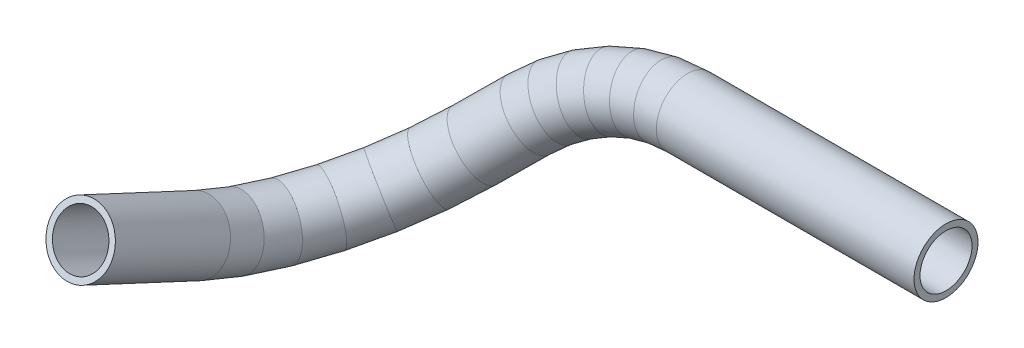
ISO-10303-21;
HEADER;
FILE_DESCRIPTION(('STEP AP214'),'2;1');
FILE_NAME('part.step','',(''),(''),'','','');
FILE_SCHEMA(('AUTOMOTIVE_DESIGN { 1 0 10303 214 1 1 1 1 }'));
ENDSEC;
DATA;
#1=APPLICATION_CONTEXT('core data for automotive mechanical design processes');
#2=APPLICATION_PROTOCOL_DEFINITION('international standard','automotive_design',2000,#1);
#3=PRODUCT_CONTEXT('',#1,'mechanical');
#4=PRODUCT('Part','Part','',(#3));
#5=PRODUCT_RELATED_PRODUCT_CATEGORY('part','',(#4));
#6=PRODUCT_DEFINITION_FORMATION('','',#4);
#7=PRODUCT_DEFINITION_CONTEXT('part definition',#1,'design');
#8=PRODUCT_DEFINITION('design','',#6,#7);
#9=PRODUCT_DEFINITION_SHAPE('','',#8);
#10=(LENGTH_UNIT() NAMED_UNIT(*) SI_UNIT(.MILLI.,.METRE.));
#11=(NAMED_UNIT(*) PLANE_ANGLE_UNIT() SI_UNIT($,.RADIAN.));
#12=(NAMED_UNIT(*) SI_UNIT($,.STERADIAN.) SOLID_ANGLE_UNIT());
#13=UNCERTAINTY_MEASURE_WITH_UNIT(LENGTH_MEASURE(1.E-05),#10,'distance_accuracy_value','');
#14=(GEOMETRIC_REPRESENTATION_CONTEXT(3) GLOBAL_UNCERTAINTY_ASSIGNED_CONTEXT((#13)) GLOBAL_UNIT_ASSIGNED_CONTEXT((#10,
#11,#12)) REPRESENTATION_CONTEXT('',''));
#15=CARTESIAN_POINT('',(0.,0.,0.));
#16=DIRECTION('',(0.,0.,1.));
#17=DIRECTION('',(1.,0.,0.));
#18=AXIS2_PLACEMENT_3D('',#15,#16,#17);
#19=CARTESIAN_POINT('',(-40.,41.0497842766596,-31.1369569621188));
#20=DIRECTION('',(0.,0.422618261740699,0.90630778703665));
#21=DIRECTION('',(0.,-0.90630778703665,0.422618261740699));
#22=AXIS2_PLACEMENT_3D('',#19,#20,#21);
#23=CYLINDRICAL_SURFACE('',#22,3.8735);
#24=CARTESIAN_POINT('',(-40.,41.0497842766596,-31.1369569621188));
#25=DIRECTION('',(-0.0379906105368384,0.380773401827311,0.923887617609358));
#26=DIRECTION('',(-0.641009785049474,-0.718554589404212,0.269788356896609));
#27=AXIS2_PLACEMENT_3D('',#24,#25,#26);
#28=ELLIPSE('',#27,3.88029697891968,3.8735);
#29=CARTESIAN_POINT('',(-42.4873083323854,38.2615790742056,-30.0900980159052));
#30=VERTEX_POINT('',#29);
#31=EDGE_CURVE('E68',#30,#30,#28,.T.);
#32=ORIENTED_EDGE('',*,*,#31,.F.);
#33=EDGE_LOOP('',(#32));
#34=FACE_BOUND('',#33,.T.);
#35=CARTESIAN_POINT('',(-40.,49.1453881812796,-13.7758783629571));
#36=DIRECTION('',(0.,0.422618261740699,0.90630778703665));
#37=DIRECTION('',(0.,-0.90630778703665,0.422618261740699));
#38=AXIS2_PLACEMENT_3D('',#35,#36,#37);
#39=CIRCLE('',#38,3.8735);
#40=CARTESIAN_POINT('',(-40.,45.6348049681931,-12.1388665261045));
#41=VERTEX_POINT('',#40);
#42=EDGE_CURVE('E11',#41,#41,#39,.F.);
#43=ORIENTED_EDGE('',*,*,#42,.F.);
#44=EDGE_LOOP('',(#43));
#45=FACE_BOUND('',#44,.T.);
#46=ADVANCED_FACE('F52',(#34,#45),#23,.F.);
#47=CARTESIAN_POINT('',(-40.,41.0497842766596,-31.1369569621188));
#48=DIRECTION('',(0.,0.422618261740699,0.90630778703665));
#49=DIRECTION('',(0.,-0.90630778703665,0.422618261740699));
#50=AXIS2_PLACEMENT_3D('',#47,#48,#49);
#51=CYLINDRICAL_SURFACE('',#50,4.7625);
#52=CARTESIAN_POINT('',(-40.,41.0497842766596,-31.1369569621188));
#53=DIRECTION('',(-0.0379906105368384,0.380773401827311,0.923887617609358));
#54=DIRECTION('',(-0.641009785049474,-0.718554589404212,0.269788356896609));
#55=AXIS2_PLACEMENT_3D('',#52,#53,#54);
#56=ELLIPSE('',#55,4.77085694129469,4.7625);
#57=CARTESIAN_POINT('',(-43.0581659824411,37.6216631261014,-29.8498353069381));
#58=VERTEX_POINT('',#57);
#59=EDGE_CURVE('E63',#58,#58,#56,.T.);
#60=ORIENTED_EDGE('',*,*,#59,.T.);
#61=EDGE_LOOP('',(#60));
#62=FACE_BOUND('',#61,.T.);
#63=CARTESIAN_POINT('',(-40.,49.1453881812796,-13.7758783629571));
#64=DIRECTION('',(0.,0.422618261740699,0.90630778703665));
#65=DIRECTION('',(0.,-0.90630778703665,0.422618261740699));
#66=AXIS2_PLACEMENT_3D('',#63,#64,#65);
#67=CIRCLE('',#66,4.7625);
#68=CARTESIAN_POINT('',(-40.,44.8290973455175,-11.763158891417));
#69=VERTEX_POINT('',#68);
#70=EDGE_CURVE('E60',#69,#69,#67,.F.);
#71=ORIENTED_EDGE('',*,*,#70,.T.);
#72=EDGE_LOOP('',(#71));
#73=FACE_BOUND('',#72,.T.);
#74=ADVANCED_FACE('F54',(#62,#73),#51,.T.);
#75=CARTESIAN_POINT('',(-39.5699639147606,39.1357245497127,-36.4564434023513));
#76=DIRECTION('',(-0.0758481274572,0.337594567324115,0.938230765683198));
#77=DIRECTION('',(0.,-0.94094125819668,0.338569857818515));
#78=AXIS2_PLACEMENT_3D('',#75,#76,#77);
#79=CYLINDRICAL_SURFACE('',#78,4.7625);
#80=CARTESIAN_POINT('',(-39.5699639147606,39.1357245497127,-36.4564434023513));
#81=DIRECTION('',(-0.150634301973628,0.247844196645671,0.957017534456909));
#82=DIRECTION('',(-0.624216419270617,-0.77452071352681,0.102330475572479));
#83=AXIS2_PLACEMENT_3D('',#80,#81,#82);
#84=ELLIPSE('',#83,4.79607502782673,4.7625);
#85=CARTESIAN_POINT('',(-42.5637526951838,35.4210650970322,-35.9656587638725));
#86=VERTEX_POINT('',#85);
#87=EDGE_CURVE('E71',#86,#86,#84,.F.);
#88=ORIENTED_EDGE('',*,*,#87,.F.);
#89=EDGE_LOOP('',(#88));
#90=FACE_BOUND('',#89,.T.);
#91=ORIENTED_EDGE('',*,*,#59,.F.);
#92=EDGE_LOOP('',(#91));
#93=FACE_BOUND('',#92,.T.);
#94=ADVANCED_FACE('F162',(#90,#93),#79,.T.);
#95=CARTESIAN_POINT('',(-39.5699639147606,39.1357245497127,-36.4564434023513));
#96=DIRECTION('',(-0.0758481274572,0.337594567324115,0.938230765683198));
#97=DIRECTION('',(0.,-0.94094125819668,0.338569857818515));
#98=AXIS2_PLACEMENT_3D('',#95,#96,#97);
#99=CYLINDRICAL_SURFACE('',#98,3.8735);
#100=CARTESIAN_POINT('',(-39.5699639147606,39.1357245497127,-36.4564434023513));
#101=DIRECTION('',(-0.150634301973628,0.247844196645671,0.957017534456909));
#102=DIRECTION('',(-0.624216419270617,-0.77452071352681,0.102330475572479));
#103=AXIS2_PLACEMENT_3D('',#100,#101,#102);
#104=ELLIPSE('',#103,3.90080768929907,3.8735);
#105=CARTESIAN_POINT('',(-42.0049121228381,36.1144681948659,-36.0572718963885));
#106=VERTEX_POINT('',#105);
#107=EDGE_CURVE('E69',#106,#106,#104,.F.);
#108=ORIENTED_EDGE('',*,*,#107,.T.);
#109=EDGE_LOOP('',(#108));
#110=FACE_BOUND('',#109,.T.);
#111=ORIENTED_EDGE('',*,*,#31,.T.);
#112=EDGE_LOOP('',(#111));
#113=FACE_BOUND('',#112,.T.);
#114=ADVANCED_FACE('F156',(#110,#113),#99,.F.);
#115=CARTESIAN_POINT('',(-38.3038551753476,38.2590543701721,-41.9129908196319));
#116=DIRECTION('',(-0.223311439057955,0.15462374855985,0.962405058988764));
#117=DIRECTION('',(0.974120386999721,0.,0.226029802529477));
#118=AXIS2_PLACEMENT_3D('',#115,#116,#117);
#119=CYLINDRICAL_SURFACE('',#118,3.8735);
#120=CARTESIAN_POINT('',(-38.3038551753476,38.2590543701721,-41.9129908196319));
#121=DIRECTION('',(-0.292861982943929,0.0592384066262703,0.954317908312807));
#122=DIRECTION('',(-0.571461888461754,-0.81104863767433,-0.125025666814217));
#123=AXIS2_PLACEMENT_3D('',#120,#121,#122);
#124=ELLIPSE('',#123,3.90080768929907,3.8735);
#125=CARTESIAN_POINT('',(-40.5330181040006,35.0953096079365,-42.4006919021005));
#126=VERTEX_POINT('',#125);
#127=EDGE_CURVE('E80',#126,#126,#124,.T.);
#128=ORIENTED_EDGE('',*,*,#127,.F.);
#129=EDGE_LOOP('',(#128));
#130=FACE_BOUND('',#129,.T.);
#131=ORIENTED_EDGE('',*,*,#107,.F.);
#132=EDGE_LOOP('',(#131));
#133=FACE_BOUND('',#132,.T.);
#134=ADVANCED_FACE('F169',(#130,#133),#119,.F.);
#135=CARTESIAN_POINT('',(-38.3038551753476,38.2590543701721,-41.9129908196319));
#136=DIRECTION('',(-0.223311439057955,0.15462374855985,0.962405058988764));
#137=DIRECTION('',(0.974120386999721,0.,0.226029802529477));
#138=AXIS2_PLACEMENT_3D('',#135,#136,#137);
#139=CYLINDRICAL_SURFACE('',#138,4.7625);
#140=CARTESIAN_POINT('',(-38.3038551753476,38.2590543701721,-41.9129908196319));
#141=DIRECTION('',(-0.292861982943929,0.0592384066262703,0.954317908312807));
#142=DIRECTION('',(-0.571461888461754,-0.81104863767433,-0.125025666814217));
#143=AXIS2_PLACEMENT_3D('',#140,#141,#142);
#144=ELLIPSE('',#143,4.79607502782673,4.7625);
#145=CARTESIAN_POINT('',(-41.0446292679537,34.3692042526693,-42.5126232980769));
#146=VERTEX_POINT('',#145);
#147=EDGE_CURVE('E74',#146,#146,#144,.T.);
#148=ORIENTED_EDGE('',*,*,#147,.T.);
#149=EDGE_LOOP('',(#148));
#150=FACE_BOUND('',#149,.T.);
#151=ORIENTED_EDGE('',*,*,#87,.T.);
#152=EDGE_LOOP('',(#151));
#153=FACE_BOUND('',#152,.T.);
#154=ADVANCED_FACE('F174',(#150,#153),#139,.T.);
#155=CARTESIAN_POINT('',(-36.2723329621855,38.4686990747489,-47.2020794231644));
#156=DIRECTION('',(-0.358312153433039,-0.0369763348222659,0.932869310978387));
#157=DIRECTION('',(0.933507698152274,0.,0.358557355928509));
#158=AXIS2_PLACEMENT_3D('',#155,#156,#157);
#159=CYLINDRICAL_SURFACE('',#158,4.7625);
#160=CARTESIAN_POINT('',(-36.2723329621855,38.4686990747489,-47.2020794231644));
#161=DIRECTION('',(-0.418745579833548,-0.132673368994171,0.8983595697323));
#162=DIRECTION('',(-0.486815129579996,-0.802313441650296,-0.345404358628069));
#163=AXIS2_PLACEMENT_3D('',#160,#161,#162);
#164=ELLIPSE('',#163,4.79607502782673,4.7625);
#165=CARTESIAN_POINT('',(-38.6071348483323,34.6207436127602,-48.8586646420829));
#166=VERTEX_POINT('',#165);
#167=EDGE_CURVE('E81',#166,#166,#164,.F.);
#168=ORIENTED_EDGE('',*,*,#167,.F.);
#169=EDGE_LOOP('',(#168));
#170=FACE_BOUND('',#169,.T.);
#171=ORIENTED_EDGE('',*,*,#147,.F.);
#172=EDGE_LOOP('',(#171));
#173=FACE_BOUND('',#172,.T.);
#174=ADVANCED_FACE('F176',(#170,#173),#159,.T.);
#175=CARTESIAN_POINT('',(-36.2723329621855,38.4686990747489,-47.2020794231644));
#176=DIRECTION('',(-0.358312153433039,-0.0369763348222659,0.932869310978387));
#177=DIRECTION('',(0.933507698152274,0.,0.358557355928509));
#178=AXIS2_PLACEMENT_3D('',#175,#176,#177);
#179=CYLINDRICAL_SURFACE('',#178,3.8735);
#180=CARTESIAN_POINT('',(-36.2723329621855,38.4686990747489,-47.2020794231644));
#181=DIRECTION('',(-0.418745579833548,-0.132673368994171,0.8983595697323));
#182=DIRECTION('',(-0.486815129579996,-0.802313441650296,-0.345404358628069));
#183=AXIS2_PLACEMENT_3D('',#180,#181,#182);
#184=ELLIPSE('',#183,3.90080768929907,3.8735);
#185=CARTESIAN_POINT('',(-38.1713051629182,35.3390286323314,-48.5494354012181));
#186=VERTEX_POINT('',#185);
#187=EDGE_CURVE('E79',#186,#186,#184,.F.);
#188=ORIENTED_EDGE('',*,*,#187,.T.);
#189=EDGE_LOOP('',(#188));
#190=FACE_BOUND('',#189,.T.);
#191=ORIENTED_EDGE('',*,*,#127,.T.);
#192=EDGE_LOOP('',(#191));
#193=FACE_BOUND('',#192,.T.);
#194=ADVANCED_FACE('F182',(#190,#193),#179,.F.);
#195=CARTESIAN_POINT('',(-33.5887727620134,39.7529587813204,-52.0285349879525));
#196=DIRECTION('',(-0.473316131106517,-0.226512837540018,0.851271856966932));
#197=DIRECTION('',(0.873988406433469,0.,0.485946772208527));
#198=AXIS2_PLACEMENT_3D('',#195,#196,#197);
#199=CYLINDRICAL_SURFACE('',#198,3.8735);
#200=CARTESIAN_POINT('',(-33.5887727620134,39.7529587813204,-52.0285349879525));
#201=DIRECTION('',(-0.521259762583388,-0.31718088996773,0.79226544980252));
#202=DIRECTION('',(-0.375000121239498,-0.748802620543144,-0.546506673827577));
#203=AXIS2_PLACEMENT_3D('',#200,#201,#202);
#204=ELLIPSE('',#203,3.90080768929907,3.8735);
#205=CARTESIAN_POINT('',(-35.0515761184325,36.8320237613384,-54.1603524234724));
#206=VERTEX_POINT('',#205);
#207=EDGE_CURVE('E84',#206,#206,#204,.T.);
#208=ORIENTED_EDGE('',*,*,#207,.F.);
#209=EDGE_LOOP('',(#208));
#210=FACE_BOUND('',#209,.T.);
#211=ORIENTED_EDGE('',*,*,#187,.F.);
#212=EDGE_LOOP('',(#211));
#213=FACE_BOUND('',#212,.T.);
#214=ADVANCED_FACE('F184',(#210,#213),#199,.F.);
#215=CARTESIAN_POINT('',(-33.5887727620134,39.7529587813204,-52.0285349879525));
#216=DIRECTION('',(-0.473316131106517,-0.226512837540018,0.851271856966932));
#217=DIRECTION('',(0.873988406433469,0.,0.485946772208527));
#218=AXIS2_PLACEMENT_3D('',#215,#216,#217);
#219=CYLINDRICAL_SURFACE('',#218,4.7625);
#220=CARTESIAN_POINT('',(-33.5887727620134,39.7529587813204,-52.0285349879525));
#221=DIRECTION('',(-0.521259762583388,-0.31718088996773,0.79226544980252));
#222=DIRECTION('',(-0.375000121239498,-0.748802620543144,-0.546506673827577));
#223=AXIS2_PLACEMENT_3D('',#220,#221,#222);
#224=ELLIPSE('',#223,4.79607502782673,4.7625);
#225=CARTESIAN_POINT('',(-35.3873014789221,36.1616452321623,-54.6496219988376));
#226=VERTEX_POINT('',#225);
#227=EDGE_CURVE('E85',#226,#226,#224,.T.);
#228=ORIENTED_EDGE('',*,*,#227,.T.);
#229=EDGE_LOOP('',(#228));
#230=FACE_BOUND('',#229,.T.);
#231=ORIENTED_EDGE('',*,*,#167,.T.);
#232=EDGE_LOOP('',(#231));
#233=FACE_BOUND('',#232,.T.);
#234=ADVANCED_FACE('F186',(#230,#233),#219,.T.);
#235=CARTESIAN_POINT('',(-30.4029390922545,42.0401613376509,-56.1230019808212));
#236=DIRECTION('',(-0.56190521338871,-0.403408078920627,0.722166499519437));
#237=DIRECTION('',(0.789235602373423,0.,0.614090517714009));
#238=AXIS2_PLACEMENT_3D('',#235,#236,#237);
#239=CYLINDRICAL_SURFACE('',#238,4.7625);
#240=CARTESIAN_POINT('',(-30.4029390922545,42.0401613376509,-56.1230019808212));
#241=DIRECTION('',(-0.594683404792938,-0.483987133765237,0.641956464578082));
#242=DIRECTION('',(-0.242257051666201,-0.653502514029382,-0.717109465197104));
#243=AXIS2_PLACEMENT_3D('',#240,#241,#242);
#244=ELLIPSE('',#243,4.79607502782673,4.7625);
#245=CARTESIAN_POINT('',(-31.5648220880657,38.9059142494926,-59.5623127790713));
#246=VERTEX_POINT('',#245);
#247=EDGE_CURVE('E90',#246,#246,#244,.F.);
#248=ORIENTED_EDGE('',*,*,#247,.F.);
#249=EDGE_LOOP('',(#248));
#250=FACE_BOUND('',#249,.T.);
#251=ORIENTED_EDGE('',*,*,#227,.F.);
#252=EDGE_LOOP('',(#251));
#253=FACE_BOUND('',#252,.T.);
#254=ADVANCED_FACE('F195',(#250,#253),#239,.T.);
#255=CARTESIAN_POINT('',(-30.4029390922545,42.0401613376509,-56.1230019808212));
#256=DIRECTION('',(-0.56190521338871,-0.403408078920627,0.722166499519437));
#257=DIRECTION('',(0.789235602373423,0.,0.614090517714009));
#258=AXIS2_PLACEMENT_3D('',#255,#256,#257);
#259=CYLINDRICAL_SURFACE('',#258,3.8735);
#260=CARTESIAN_POINT('',(-30.4029390922545,42.0401613376509,-56.1230019808212));
#261=DIRECTION('',(-0.594683404792938,-0.483987133765237,0.641956464578082));
#262=DIRECTION('',(-0.242257051666201,-0.653502514029382,-0.717109465197104));
#263=AXIS2_PLACEMENT_3D('',#260,#261,#262);
#264=ELLIPSE('',#263,3.90080768929907,3.8735);
#265=CARTESIAN_POINT('',(-31.3479372621809,39.4909737059488,-58.9203080967313));
#266=VERTEX_POINT('',#265);
#267=EDGE_CURVE('E88',#266,#266,#264,.F.);
#268=ORIENTED_EDGE('',*,*,#267,.T.);
#269=EDGE_LOOP('',(#268));
#270=FACE_BOUND('',#269,.T.);
#271=ORIENTED_EDGE('',*,*,#207,.T.);
#272=EDGE_LOOP('',(#271));
#273=FACE_BOUND('',#272,.T.);
#274=ADVANCED_FACE('F197',(#270,#273),#259,.F.);
#275=CARTESIAN_POINT('',(-26.8926274210751,45.2026622112734,-59.2569757931343));
#276=DIRECTION('',(-0.619135407908546,-0.557789863640089,0.552758369176161));
#277=DIRECTION('',(0.669341214327033,-0.742955139159299,0.));
#278=AXIS2_PLACEMENT_3D('',#275,#276,#277);
#279=CYLINDRICAL_SURFACE('',#278,3.8735);
#280=CARTESIAN_POINT('',(-26.8926274210751,45.2026622112734,-59.2569757931343));
#281=DIRECTION('',(-0.628127407094665,-0.591823084028183,0.505174620965765));
#282=DIRECTION('',(-0.133389622814733,-0.557722618067779,-0.819239091975576));
#283=AXIS2_PLACEMENT_3D('',#280,#281,#282);
#284=ELLIPSE('',#283,3.88029697891968,3.8735);
#285=CARTESIAN_POINT('',(-27.4102187715023,43.0385328213098,-62.4358667667401));
#286=VERTEX_POINT('',#285);
#287=EDGE_CURVE('E91',#286,#286,#284,.T.);
#288=ORIENTED_EDGE('',*,*,#287,.F.);
#289=EDGE_LOOP('',(#288));
#290=FACE_BOUND('',#289,.T.);
#291=ORIENTED_EDGE('',*,*,#267,.F.);
#292=EDGE_LOOP('',(#291));
#293=FACE_BOUND('',#292,.T.);
#294=ADVANCED_FACE('F199',(#290,#293),#279,.F.);
#295=CARTESIAN_POINT('',(-26.8926274210751,45.2026622112734,-59.2569757931343));
#296=DIRECTION('',(-0.619135407908546,-0.557789863640089,0.552758369176161));
#297=DIRECTION('',(0.669341214327033,-0.742955139159299,0.));
#298=AXIS2_PLACEMENT_3D('',#295,#296,#297);
#299=CYLINDRICAL_SURFACE('',#298,4.7625);
#300=CARTESIAN_POINT('',(-26.8926274210751,45.2026622112734,-59.2569757931343));
#301=DIRECTION('',(-0.628127407094665,-0.591823084028183,0.505174620965765));
#302=DIRECTION('',(-0.133389622814733,-0.557722618067779,-0.819239091975576));
#303=AXIS2_PLACEMENT_3D('',#300,#301,#302);
#304=ELLIPSE('',#303,4.77085694129469,4.7625);
#305=CARTESIAN_POINT('',(-27.5290102289774,42.5418473875477,-63.165448301666));
#306=VERTEX_POINT('',#305);
#307=EDGE_CURVE('E89',#306,#306,#304,.T.);
#308=ORIENTED_EDGE('',*,*,#307,.T.);
#309=EDGE_LOOP('',(#308));
#310=FACE_BOUND('',#309,.T.);
#311=ORIENTED_EDGE('',*,*,#247,.T.);
#312=EDGE_LOOP('',(#311));
#313=FACE_BOUND('',#312,.T.);
#314=ADVANCED_FACE('F202',(#310,#313),#299,.T.);
#315=CARTESIAN_POINT('',(-22.2007223629348,49.8122754010729,-62.625389197533));
#316=DIRECTION('',(-0.634918869173399,-0.623782953305178,0.45582107973792));
#317=DIRECTION('',(0.700823479025489,-0.713334739968978,0.));
#318=AXIS2_PLACEMENT_3D('',#315,#316,#317);
#319=CYLINDRICAL_SURFACE('',#318,4.7625);
#320=CARTESIAN_POINT('',(-22.2007223629348,49.8122754010729,-62.625389197533));
#321=DIRECTION('',(-0.662903902701183,-0.60450673541284,0.441735240414495));
#322=DIRECTION('',(-0.748704491627732,0.535231027188201,-0.391112939892714));
#323=AXIS2_PLACEMENT_3D('',#320,#321,#322);
#324=ELLIPSE('',#323,4.76572435934809,4.7625);
#325=CARTESIAN_POINT('',(-25.7688415966384,52.3630389452226,-64.489325662436));
#326=VERTEX_POINT('',#325);
#327=EDGE_CURVE('E100',#326,#326,#324,.F.);
#328=ORIENTED_EDGE('',*,*,#327,.F.);
#329=EDGE_LOOP('',(#328));
#330=FACE_BOUND('',#329,.T.);
#331=ORIENTED_EDGE('',*,*,#307,.F.);
#332=EDGE_LOOP('',(#331));
#333=FACE_BOUND('',#332,.T.);
#334=ADVANCED_FACE('F208',(#330,#333),#319,.T.);
#335=CARTESIAN_POINT('',(-22.2007223629348,49.8122754010729,-62.625389197533));
#336=DIRECTION('',(-0.634918869173399,-0.623782953305178,0.45582107973792));
#337=DIRECTION('',(0.700823479025489,-0.713334739968978,0.));
#338=AXIS2_PLACEMENT_3D('',#335,#336,#337);
#339=CYLINDRICAL_SURFACE('',#338,3.8735);
#340=CARTESIAN_POINT('',(-22.2007223629348,49.8122754010729,-62.625389197533));
#341=DIRECTION('',(-0.662903902701183,-0.60450673541284,0.441735240414495));
#342=DIRECTION('',(-0.748704491627732,0.535231027188201,-0.391112939892714));
#343=AXIS2_PLACEMENT_3D('',#340,#341,#342);
#344=ELLIPSE('',#343,3.87612247893645,3.8735);
#345=CARTESIAN_POINT('',(-25.1027926730137,51.8868964169813,-64.1413908556541));
#346=VERTEX_POINT('',#345);
#347=EDGE_CURVE('E94',#346,#346,#344,.F.);
#348=ORIENTED_EDGE('',*,*,#347,.T.);
#349=EDGE_LOOP('',(#348));
#350=FACE_BOUND('',#349,.T.);
#351=ORIENTED_EDGE('',*,*,#287,.T.);
#352=EDGE_LOOP('',(#351));
#353=FACE_BOUND('',#352,.T.);
#354=ADVANCED_FACE('F213',(#350,#353),#339,.F.);
#355=CARTESIAN_POINT('',(-19.7661645079907,51.8743083853491,-64.1321923193044));
#356=DIRECTION('',(-0.689991930764786,-0.584412531923208,0.427051669017449));
#357=DIRECTION('',(0.646311586997243,-0.763073608843279,0.));
#358=AXIS2_PLACEMENT_3D('',#355,#356,#357);
#359=CYLINDRICAL_SURFACE('',#358,3.8735);
#360=CARTESIAN_POINT('',(-19.7661645079907,51.8743083853491,-64.1321923193044));
#361=DIRECTION('',(-0.741331617698427,-0.541879999740994,0.395971587972336));
#362=DIRECTION('',(-0.671138907083052,0.598553850129726,-0.437385248830191));
#363=AXIS2_PLACEMENT_3D('',#360,#361,#362);
#364=ELLIPSE('',#363,3.8840076996337,3.8735);
#365=CARTESIAN_POINT('',(-22.372873190625,54.1990961478983,-65.830999993467));
#366=VERTEX_POINT('',#365);
#367=EDGE_CURVE('E101',#366,#366,#364,.T.);
#368=ORIENTED_EDGE('',*,*,#367,.F.);
#369=EDGE_LOOP('',(#368));
#370=FACE_BOUND('',#369,.T.);
#371=ORIENTED_EDGE('',*,*,#347,.F.);
#372=EDGE_LOOP('',(#371));
#373=FACE_BOUND('',#372,.T.);
#374=ADVANCED_FACE('F216',(#370,#373),#359,.F.);
#375=CARTESIAN_POINT('',(-19.7661645079907,51.8743083853491,-64.1321923193044));
#376=DIRECTION('',(-0.689991930764786,-0.584412531923208,0.427051669017449));
#377=DIRECTION('',(0.646311586997243,-0.763073608843279,0.));
#378=AXIS2_PLACEMENT_3D('',#375,#376,#377);
#379=CYLINDRICAL_SURFACE('',#378,4.7625);
#380=CARTESIAN_POINT('',(-19.7661645079907,51.8743083853491,-64.1321923193044));
#381=DIRECTION('',(-0.741331617698427,-0.541879999740994,0.395971587972336));
#382=DIRECTION('',(-0.671138907083052,0.598553850129726,-0.437385248830191));
#383=AXIS2_PLACEMENT_3D('',#380,#381,#382);
#384=ELLIPSE('',#383,4.77541930282833,4.7625);
#385=CARTESIAN_POINT('',(-22.9711341997542,54.7326539950408,-66.2208902793404));
#386=VERTEX_POINT('',#385);
#387=EDGE_CURVE('E98',#386,#386,#384,.T.);
#388=ORIENTED_EDGE('',*,*,#387,.T.);
#389=EDGE_LOOP('',(#388));
#390=FACE_BOUND('',#389,.T.);
#391=ORIENTED_EDGE('',*,*,#327,.T.);
#392=EDGE_LOOP('',(#391));
#393=FACE_BOUND('',#392,.T.);
#394=ADVANCED_FACE('F222',(#390,#393),#379,.T.);
#395=CARTESIAN_POINT('',(-16.9834671138287,53.6258538395745,-65.4121108164751));
#396=DIRECTION('',(-0.788660143702353,-0.496415489707486,0.362749003187962));
#397=DIRECTION('',(0.532699300034266,-0.846304588043219,0.));
#398=AXIS2_PLACEMENT_3D('',#395,#396,#397);
#399=CYLINDRICAL_SURFACE('',#398,4.7625);
#400=CARTESIAN_POINT('',(-16.9834671138287,53.6258538395745,-65.4121108164751));
#401=DIRECTION('',(-0.831721425898354,-0.448264998974274,0.32756367380435));
#402=DIRECTION('',(-0.555193182326304,0.671534910722436,-0.49071518621233));
#403=AXIS2_PLACEMENT_3D('',#400,#401,#402);
#404=ELLIPSE('',#403,4.77541930282833,4.7625);
#405=CARTESIAN_POINT('',(-19.6347473535085,56.8327146147615,-67.7554815889045));
#406=VERTEX_POINT('',#405);
#407=EDGE_CURVE('E104',#406,#406,#404,.F.);
#408=ORIENTED_EDGE('',*,*,#407,.F.);
#409=EDGE_LOOP('',(#408));
#410=FACE_BOUND('',#409,.T.);
#411=ORIENTED_EDGE('',*,*,#387,.F.);
#412=EDGE_LOOP('',(#411));
#413=FACE_BOUND('',#412,.T.);
#414=ADVANCED_FACE('F221',(#410,#413),#399,.T.);
#415=CARTESIAN_POINT('',(-16.9834671138287,53.6258538395745,-65.4121108164751));
#416=DIRECTION('',(-0.788660143702353,-0.496415489707486,0.362749003187962));
#417=DIRECTION('',(0.532699300034266,-0.846304588043219,0.));
#418=AXIS2_PLACEMENT_3D('',#415,#416,#417);
#419=CYLINDRICAL_SURFACE('',#418,3.8735);
#420=CARTESIAN_POINT('',(-16.9834671138287,53.6258538395745,-65.4121108164751));
#421=DIRECTION('',(-0.831721425898354,-0.448264998974274,0.32756367380435));
#422=DIRECTION('',(-0.555193182326304,0.671534910722436,-0.49071518621233));
#423=AXIS2_PLACEMENT_3D('',#420,#421,#422);
#424=ELLIPSE('',#423,3.8840076996337,3.8735);
#425=CARTESIAN_POINT('',(-19.1398417087682,56.2341006033933,-67.318052378051));
#426=VERTEX_POINT('',#425);
#427=EDGE_CURVE('E105',#426,#426,#424,.F.);
#428=ORIENTED_EDGE('',*,*,#427,.T.);
#429=EDGE_LOOP('',(#428));
#430=FACE_BOUND('',#429,.T.);
#431=ORIENTED_EDGE('',*,*,#367,.T.);
#432=EDGE_LOOP('',(#431));
#433=FACE_BOUND('',#432,.T.);
#434=ADVANCED_FACE('F226',(#430,#433),#419,.F.);
#435=CARTESIAN_POINT('',(-13.912774646468,55.0290543358185,-66.4374808781251));
#436=DIRECTION('',(-0.870282470402715,-0.397689057866199,0.290605978884196));
#437=DIRECTION('',(0.41562632156312,-0.90953546430247,0.));
#438=AXIS2_PLACEMENT_3D('',#435,#436,#437);
#439=CYLINDRICAL_SURFACE('',#438,3.8735);
#440=CARTESIAN_POINT('',(-13.912774646468,55.0290543358185,-66.4374808781251));
#441=DIRECTION('',(-0.90413463299815,-0.344961320216596,0.252075887319126));
#442=DIRECTION('',(-0.427247662852942,0.730001598065966,-0.533438938781033));
#443=AXIS2_PLACEMENT_3D('',#440,#441,#442);
#444=ELLIPSE('',#443,3.8840076996337,3.8735);
#445=CARTESIAN_POINT('',(-15.5722078586394,57.8643861634516,-68.509361823635));
#446=VERTEX_POINT('',#445);
#447=EDGE_CURVE('E108',#446,#446,#444,.T.);
#448=ORIENTED_EDGE('',*,*,#447,.F.);
#449=EDGE_LOOP('',(#448));
#450=FACE_BOUND('',#449,.T.);
#451=ORIENTED_EDGE('',*,*,#427,.F.);
#452=EDGE_LOOP('',(#451));
#453=FACE_BOUND('',#452,.T.);
#454=ADVANCED_FACE('F235',(#450,#453),#439,.F.);
#455=CARTESIAN_POINT('',(-13.912774646468,55.0290543358185,-66.4374808781251));
#456=DIRECTION('',(-0.870282470402715,-0.397689057866199,0.290605978884196));
#457=DIRECTION('',(0.41562632156312,-0.90953546430247,0.));
#458=AXIS2_PLACEMENT_3D('',#455,#456,#457);
#459=CYLINDRICAL_SURFACE('',#458,4.7625);
#460=CARTESIAN_POINT('',(-13.912774646468,55.0290543358185,-66.4374808781251));
#461=DIRECTION('',(-0.90413463299815,-0.344961320216596,0.252075887319126));
#462=DIRECTION('',(-0.427247662852942,0.730001598065966,-0.533438938781033));
#463=AXIS2_PLACEMENT_3D('',#460,#461,#462);
#464=ELLIPSE('',#463,4.77541930282833,4.7625);
#465=CARTESIAN_POINT('',(-15.9530613827443,58.5151180583182,-68.9848754832603));
#466=VERTEX_POINT('',#465);
#467=EDGE_CURVE('E106',#466,#466,#464,.T.);
#468=ORIENTED_EDGE('',*,*,#467,.T.);
#469=EDGE_LOOP('',(#468));
#470=FACE_BOUND('',#469,.T.);
#471=ORIENTED_EDGE('',*,*,#407,.T.);
#472=EDGE_LOOP('',(#471));
#473=FACE_BOUND('',#472,.T.);
#474=ADVANCED_FACE('F240',(#470,#473),#459,.T.);
#475=CARTESIAN_POINT('',(-10.6204562192535,56.053581479502,-67.1861404341135));
#476=DIRECTION('',(-0.933094748055744,-0.29036708269449,0.21218187584777));
#477=DIRECTION('',(0.297132737561571,-0.954836182949288,0.));
#478=AXIS2_PLACEMENT_3D('',#475,#476,#477);
#479=CYLINDRICAL_SURFACE('',#478,4.7625);
#480=CARTESIAN_POINT('',(-10.6204562192535,56.053581479502,-67.1861404341135));
#481=DIRECTION('',(-0.957006119598603,-0.234201741135306,0.171139801040011));
#482=DIRECTION('',(-0.290067728385671,0.772690229052759,-0.564633086947241));
#483=AXIS2_PLACEMENT_3D('',#480,#481,#482);
#484=ELLIPSE('',#483,4.77541930282833,4.7625);
#485=CARTESIAN_POINT('',(-12.005651248514,59.7435013144273,-69.8825001765369));
#486=VERTEX_POINT('',#485);
#487=EDGE_CURVE('E114',#486,#486,#484,.F.);
#488=ORIENTED_EDGE('',*,*,#487,.F.);
#489=EDGE_LOOP('',(#488));
#490=FACE_BOUND('',#489,.T.);
#491=ORIENTED_EDGE('',*,*,#467,.F.);
#492=EDGE_LOOP('',(#491));
#493=FACE_BOUND('',#492,.T.);
#494=ADVANCED_FACE('F238',(#490,#493),#479,.T.);
#495=CARTESIAN_POINT('',(-10.6204562192535,56.053581479502,-67.1861404341135));
#496=DIRECTION('',(-0.933094748055744,-0.29036708269449,0.21218187584777));
#497=DIRECTION('',(0.297132737561571,-0.954836182949288,0.));
#498=AXIS2_PLACEMENT_3D('',#495,#496,#497);
#499=CYLINDRICAL_SURFACE('',#498,3.8735);
#500=CARTESIAN_POINT('',(-10.6204562192535,56.053581479502,-67.1861404341135));
#501=DIRECTION('',(-0.957006119598603,-0.234201741135306,0.171139801040011));
#502=DIRECTION('',(-0.290067728385671,0.772690229052759,-0.564633086947241));
#503=AXIS2_PLACEMENT_3D('',#500,#501,#502);
#504=ELLIPSE('',#503,3.8840076996337,3.8735);
#505=CARTESIAN_POINT('',(-11.7470815097187,59.0547162785746,-69.3791796912845));
#506=VERTEX_POINT('',#505);
#507=EDGE_CURVE('E109',#506,#506,#504,.F.);
#508=ORIENTED_EDGE('',*,*,#507,.T.);
#509=EDGE_LOOP('',(#508));
#510=FACE_BOUND('',#509,.T.);
#511=ORIENTED_EDGE('',*,*,#447,.T.);
#512=EDGE_LOOP('',(#511));
#513=FACE_BOUND('',#512,.T.);
#514=ADVANCED_FACE('F243',(#510,#513),#499,.F.);
#515=CARTESIAN_POINT('',(-7.17767110885856,56.6772914190843,-67.6419081600465));
#516=DIRECTION('',(-0.975739369144791,-0.176769192227501,0.129171731350795));
#517=DIRECTION('',(0.178262634066173,-0.983982943600035,0.));
#518=AXIS2_PLACEMENT_3D('',#515,#516,#517);
#519=CYLINDRICAL_SURFACE('',#518,3.8735);
#520=CARTESIAN_POINT('',(-7.17767110885856,56.6772914190843,-67.6419081600465));
#521=DIRECTION('',(-0.989193135742107,-0.118380189203196,0.0865047455629659));
#522=DIRECTION('',(-0.14661834878588,0.798678143201998,-0.583623408861151));
#523=AXIS2_PLACEMENT_3D('',#520,#521,#522);
#524=ELLIPSE('',#523,3.8840076996337,3.8735);
#525=CARTESIAN_POINT('',(-7.7471379044505,59.77936347681,-69.9087059737497));
#526=VERTEX_POINT('',#525);
#527=EDGE_CURVE('E120',#526,#526,#524,.T.);
#528=ORIENTED_EDGE('',*,*,#527,.F.);
#529=EDGE_LOOP('',(#528));
#530=FACE_BOUND('',#529,.T.);
#531=ORIENTED_EDGE('',*,*,#507,.F.);
#532=EDGE_LOOP('',(#531));
#533=FACE_BOUND('',#532,.T.);
#534=ADVANCED_FACE('F247',(#530,#533),#519,.F.);
#535=CARTESIAN_POINT('',(-7.17767110885856,56.6772914190843,-67.6419081600465));
#536=DIRECTION('',(-0.975739369144791,-0.176769192227501,0.129171731350795));
#537=DIRECTION('',(0.178262634066173,-0.983982943600035,0.));
#538=AXIS2_PLACEMENT_3D('',#535,#536,#537);
#539=CYLINDRICAL_SURFACE('',#538,4.7625);
#540=CARTESIAN_POINT('',(-7.17767110885856,56.6772914190843,-67.6419081600465));
#541=DIRECTION('',(-0.989193135742107,-0.118380189203196,0.0865047455629659));
#542=DIRECTION('',(-0.14661834878588,0.798678143201998,-0.583623408861151));
#543=AXIS2_PLACEMENT_3D('',#540,#541,#542);
#544=ELLIPSE('',#543,4.77541930282833,4.7625);
#545=CARTESIAN_POINT('',(-7.87783520179947,60.4913144408782,-70.4289546523045));
#546=VERTEX_POINT('',#545);
#547=EDGE_CURVE('E111',#546,#546,#544,.T.);
#548=ORIENTED_EDGE('',*,*,#547,.T.);
#549=EDGE_LOOP('',(#548));
#550=FACE_BOUND('',#549,.T.);
#551=ORIENTED_EDGE('',*,*,#487,.T.);
#552=EDGE_LOOP('',(#551));
#553=FACE_BOUND('',#552,.T.);
#554=ADVANCED_FACE('F251',(#550,#553),#539,.T.);
#555=CARTESIAN_POINT('',(-3.65883073799743,56.8867034572587,-67.7949332160296));
#556=DIRECTION('',(-0.997294624406977,-0.0593506604297553,0.0433697041204839));
#557=DIRECTION('',(0.0594065565502207,-0.998233870913448,0.));
#558=AXIS2_PLACEMENT_3D('',#555,#556,#557);
#559=CYLINDRICAL_SURFACE('',#558,4.7625);
#560=CARTESIAN_POINT('',(-3.65883073799743,56.8867034572587,-67.7949332160296));
#561=DIRECTION('',(-0.999323427226385,-0.0296954213284495,0.0216995333737227));
#562=DIRECTION('',(0.0367789042320654,-0.806857377469267,0.589600275294123));
#563=AXIS2_PLACEMENT_3D('',#560,#561,#562);
#564=ELLIPSE('',#563,4.76572435934809,4.7625);
#565=CARTESIAN_POINT('',(-3.48355261818854,53.0414435989337,-64.985060821782));
#566=VERTEX_POINT('',#565);
#567=EDGE_CURVE('E121',#566,#566,#564,.F.);
#568=ORIENTED_EDGE('',*,*,#567,.F.);
#569=EDGE_LOOP('',(#568));
#570=FACE_BOUND('',#569,.T.);
#571=ORIENTED_EDGE('',*,*,#547,.F.);
#572=EDGE_LOOP('',(#571));
#573=FACE_BOUND('',#572,.T.);
#574=ADVANCED_FACE('F258',(#570,#573),#559,.T.);
#575=CARTESIAN_POINT('',(-3.65883073799743,56.8867034572587,-67.7949332160296));
#576=DIRECTION('',(-0.997294624406977,-0.0593506604297553,0.0433697041204839));
#577=DIRECTION('',(0.0594065565502207,-0.998233870913448,0.));
#578=AXIS2_PLACEMENT_3D('',#575,#576,#577);
#579=CYLINDRICAL_SURFACE('',#578,3.8735);
#580=CARTESIAN_POINT('',(-3.65883073799743,56.8867034572587,-67.7949332160296));
#581=DIRECTION('',(-0.999323427226385,-0.0296954213284495,0.0216995333737227));
#582=DIRECTION('',(0.0367789042320654,-0.806857377469267,0.589600275294123));
#583=AXIS2_PLACEMENT_3D('',#580,#581,#582);
#584=ELLIPSE('',#583,3.87612247893645,3.8735);
#585=CARTESIAN_POINT('',(-3.51627120055287,53.7592254391544,-65.5095703353749));
#586=VERTEX_POINT('',#585);
#587=EDGE_CURVE('E119',#586,#586,#584,.F.);
#588=ORIENTED_EDGE('',*,*,#587,.T.);
#589=EDGE_LOOP('',(#588));
#590=FACE_BOUND('',#589,.T.);
#591=ORIENTED_EDGE('',*,*,#527,.T.);
#592=EDGE_LOOP('',(#591));
#593=FACE_BOUND('',#592,.T.);
#594=ADVANCED_FACE('F261',(#590,#593),#579,.F.);
#595=CARTESIAN_POINT('',(-17.1292149196012,56.8867034572587,-67.7949332160296));
#596=DIRECTION('',(1.,0.,0.));
#597=DIRECTION('',(0.,0.,-1.));
#598=AXIS2_PLACEMENT_3D('',#595,#596,#597);
#599=CYLINDRICAL_SURFACE('',#598,3.8735);
#600=CARTESIAN_POINT('',(34.8,56.8867034572587,-67.7949332160296));
#601=DIRECTION('',(1.,0.,0.));
#602=DIRECTION('',(0.,0.,-1.));
#603=AXIS2_PLACEMENT_3D('',#600,#601,#602);
#604=CIRCLE('',#603,3.8735);
#605=CARTESIAN_POINT('',(34.8,56.8867034572587,-71.6684332160296));
#606=VERTEX_POINT('',#605);
#607=EDGE_CURVE('E125',#606,#606,#604,.T.);
#608=ORIENTED_EDGE('',*,*,#607,.T.);
#609=EDGE_LOOP('',(#608));
#610=FACE_BOUND('',#609,.T.);
#611=ORIENTED_EDGE('',*,*,#587,.F.);
#612=EDGE_LOOP('',(#611));
#613=FACE_BOUND('',#612,.T.);
#614=ADVANCED_FACE('F262',(#610,#613),#599,.F.);
#615=CARTESIAN_POINT('',(34.8,56.8867034572587,-67.7949332160296));
#616=DIRECTION('',(1.,0.,0.));
#617=DIRECTION('',(0.,0.,-1.));
#618=AXIS2_PLACEMENT_3D('',#615,#616,#617);
#619=PLANE('',#618);
#620=ORIENTED_EDGE('',*,*,#607,.F.);
#621=EDGE_LOOP('',(#620));
#622=FACE_BOUND('',#621,.T.);
#623=CARTESIAN_POINT('',(34.8,56.8867034572587,-67.7949332160296));
#624=DIRECTION('',(1.,0.,0.));
#625=DIRECTION('',(0.,0.,-1.));
#626=AXIS2_PLACEMENT_3D('',#623,#624,#625);
#627=CIRCLE('',#626,4.7625);
#628=CARTESIAN_POINT('',(34.8,56.8867034572587,-72.5574332160296));
#629=VERTEX_POINT('',#628);
#630=EDGE_CURVE('E124',#629,#629,#627,.T.);
#631=ORIENTED_EDGE('',*,*,#630,.T.);
#632=EDGE_LOOP('',(#631));
#633=FACE_BOUND('',#632,.T.);
#634=ADVANCED_FACE('F271',(#622,#633),#619,.T.);
#635=CARTESIAN_POINT('',(-17.1292149196012,56.8867034572587,-67.7949332160296));
#636=DIRECTION('',(1.,0.,0.));
#637=DIRECTION('',(0.,0.,-1.));
#638=AXIS2_PLACEMENT_3D('',#635,#636,#637);
#639=CYLINDRICAL_SURFACE('',#638,4.7625);
#640=ORIENTED_EDGE('',*,*,#630,.F.);
#641=EDGE_LOOP('',(#640));
#642=FACE_BOUND('',#641,.T.);
#643=ORIENTED_EDGE('',*,*,#567,.T.);
#644=EDGE_LOOP('',(#643));
#645=FACE_BOUND('',#644,.T.);
#646=ADVANCED_FACE('F272',(#642,#645),#639,.T.);
#647=CARTESIAN_POINT('',(-40.,49.1453881812796,-13.7758783629571));
#648=DIRECTION('',(0.,0.422618261740699,0.90630778703665));
#649=DIRECTION('',(0.,-0.90630778703665,0.422618261740699));
#650=AXIS2_PLACEMENT_3D('',#647,#648,#649);
#651=PLANE('',#650);
#652=ORIENTED_EDGE('',*,*,#70,.F.);
#653=EDGE_LOOP('',(#652));
#654=FACE_BOUND('',#653,.T.);
#655=ORIENTED_EDGE('',*,*,#42,.T.);
#656=EDGE_LOOP('',(#655));
#657=FACE_BOUND('',#656,.T.);
#658=ADVANCED_FACE('F277',(#654,#657),#651,.T.);
#659=CLOSED_SHELL('',(#46,#74,#94,#114,#134,#154,#174,#194,#214,#234,#254,#274,#294,#314,#334,
#354,#374,#394,#414,#434,#454,#474,#494,#514,#534,#554,#574,#594,#614,#634,#646,#658));
#660=MANIFOLD_SOLID_BREP('B2',#659);
#661=ADVANCED_BREP_SHAPE_REPRESENTATION('',(#18,#660),#14);
#662=SHAPE_DEFINITION_REPRESENTATION(#9,#661);
ENDSEC;
END-ISO-10303-21;
